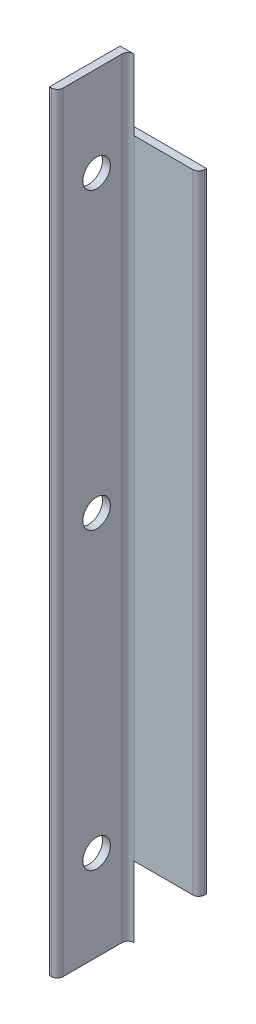
ISO-10303-21;
HEADER;
FILE_DESCRIPTION(('STEP AP214'),'2;1');
FILE_NAME('part.step','',(''),(''),'','','');
FILE_SCHEMA(('AUTOMOTIVE_DESIGN { 1 0 10303 214 1 1 1 1 }'));
ENDSEC;
DATA;
#1=APPLICATION_CONTEXT('core data for automotive mechanical design processes');
#2=APPLICATION_PROTOCOL_DEFINITION('international standard','automotive_design',2000,#1);
#3=PRODUCT_CONTEXT('',#1,'mechanical');
#4=PRODUCT('Part','Part','',(#3));
#5=PRODUCT_RELATED_PRODUCT_CATEGORY('part','',(#4));
#6=PRODUCT_DEFINITION_FORMATION('','',#4);
#7=PRODUCT_DEFINITION_CONTEXT('part definition',#1,'design');
#8=PRODUCT_DEFINITION('design','',#6,#7);
#9=PRODUCT_DEFINITION_SHAPE('','',#8);
#10=(LENGTH_UNIT() NAMED_UNIT(*) SI_UNIT(.MILLI.,.METRE.));
#11=(NAMED_UNIT(*) PLANE_ANGLE_UNIT() SI_UNIT($,.RADIAN.));
#12=(NAMED_UNIT(*) SI_UNIT($,.STERADIAN.) SOLID_ANGLE_UNIT());
#13=UNCERTAINTY_MEASURE_WITH_UNIT(LENGTH_MEASURE(1.E-05),#10,'distance_accuracy_value','');
#14=(GEOMETRIC_REPRESENTATION_CONTEXT(3) GLOBAL_UNCERTAINTY_ASSIGNED_CONTEXT((#13)) GLOBAL_UNIT_ASSIGNED_CONTEXT((#10,
#11,#12)) REPRESENTATION_CONTEXT('',''));
#15=CARTESIAN_POINT('',(0.,0.,0.));
#16=DIRECTION('',(0.,0.,1.));
#17=DIRECTION('',(1.,0.,0.));
#18=AXIS2_PLACEMENT_3D('',#15,#16,#17);
#19=CARTESIAN_POINT('',(-27.4998721449561,392.,-28.2131532770167));
#20=DIRECTION('',(-1.,0.,0.));
#21=DIRECTION('',(0.,0.,1.));
#22=AXIS2_PLACEMENT_3D('',#19,#20,#21);
#23=PLANE('',#22);
#24=DIRECTION('',(0.,-1.,0.));
#25=VECTOR('',#24,1.);
#26=CARTESIAN_POINT('',(-27.4998721449561,392.,-29.2131532770166));
#27=LINE('',#26,#25);
#28=CARTESIAN_POINT('',(-27.4998721449561,356.,-29.2131532770166));
#29=VERTEX_POINT('',#28);
#30=CARTESIAN_POINT('',(-27.4998721449561,36.,-29.2131532770166));
#31=VERTEX_POINT('',#30);
#32=EDGE_CURVE('E157',#29,#31,#27,.T.);
#33=ORIENTED_EDGE('',*,*,#32,.F.);
#34=DIRECTION('',(0.,0.,-1.));
#35=VECTOR('',#34,1.);
#36=CARTESIAN_POINT('',(-27.4998721449561,356.,-29.2131532770166));
#37=LINE('',#36,#35);
#38=CARTESIAN_POINT('',(-27.4998721449561,356.,-28.2131532770167));
#39=VERTEX_POINT('',#38);
#40=EDGE_CURVE('E140',#39,#29,#37,.T.);
#41=ORIENTED_EDGE('',*,*,#40,.F.);
#42=DIRECTION('',(0.,-1.,0.));
#43=VECTOR('',#42,1.);
#44=CARTESIAN_POINT('',(-27.4998721449561,392.,-28.2131532770167));
#45=LINE('',#44,#43);
#46=CARTESIAN_POINT('',(-27.4998721449561,36.,-28.2131532770167));
#47=VERTEX_POINT('',#46);
#48=EDGE_CURVE('E186',#39,#47,#45,.T.);
#49=ORIENTED_EDGE('',*,*,#48,.T.);
#50=DIRECTION('',(0.,0.,1.));
#51=VECTOR('',#50,1.);
#52=CARTESIAN_POINT('',(-27.4998721449561,36.,-29.2131532770166));
#53=LINE('',#52,#51);
#54=EDGE_CURVE('E163',#31,#47,#53,.T.);
#55=ORIENTED_EDGE('',*,*,#54,.F.);
#56=EDGE_LOOP('',(#33,#41,#49,#55));
#57=FACE_BOUND('',#56,.T.);
#58=ADVANCED_FACE('F44',(#57),#23,.F.);
#59=CARTESIAN_POINT('',(-27.4998721449561,392.,-29.2131532770166));
#60=DIRECTION('',(0.,0.,1.));
#61=DIRECTION('',(1.,0.,0.));
#62=AXIS2_PLACEMENT_3D('',#59,#60,#61);
#63=PLANE('',#62);
#64=DIRECTION('',(0.,-1.,0.));
#65=VECTOR('',#64,1.);
#66=CARTESIAN_POINT('',(-67.4998721449565,392.000000000002,-29.2131532770166));
#67=LINE('',#66,#65);
#68=CARTESIAN_POINT('',(-67.4998721449565,356.,-29.2131532770166));
#69=VERTEX_POINT('',#68);
#70=CARTESIAN_POINT('',(-67.499872144956,36.,-29.2131532770166));
#71=VERTEX_POINT('',#70);
#72=EDGE_CURVE('E159',#69,#71,#67,.T.);
#73=ORIENTED_EDGE('',*,*,#72,.F.);
#74=DIRECTION('',(1.,0.,0.));
#75=VECTOR('',#74,1.);
#76=CARTESIAN_POINT('',(-67.4998721449565,356.,-29.2131532770166));
#77=LINE('',#76,#75);
#78=EDGE_CURVE('E144',#69,#29,#77,.T.);
#79=ORIENTED_EDGE('',*,*,#78,.T.);
#80=ORIENTED_EDGE('',*,*,#32,.T.);
#81=DIRECTION('',(1.,0.,0.));
#82=VECTOR('',#81,1.);
#83=CARTESIAN_POINT('',(-67.499872144956,36.,-29.2131532770166));
#84=LINE('',#83,#82);
#85=EDGE_CURVE('E208',#71,#31,#84,.T.);
#86=ORIENTED_EDGE('',*,*,#85,.F.);
#87=EDGE_LOOP('',(#73,#79,#80,#86));
#88=FACE_BOUND('',#87,.T.);
#89=ADVANCED_FACE('F155',(#88),#63,.F.);
#90=CARTESIAN_POINT('',(-67.4998721449565,392.000000000002,-29.2131532770166));
#91=DIRECTION('',(1.,0.,0.));
#92=DIRECTION('',(0.,0.,-1.));
#93=AXIS2_PLACEMENT_3D('',#90,#91,#92);
#94=PLANE('',#93);
#95=CARTESIAN_POINT('',(-67.499872144956,346.,-9.21315327701655));
#96=DIRECTION('',(1.,0.,0.));
#97=DIRECTION('',(0.,0.,-1.));
#98=AXIS2_PLACEMENT_3D('',#95,#96,#97);
#99=CIRCLE('',#98,7.00000000000002);
#100=CARTESIAN_POINT('',(-67.499872144956,346.,-16.2131532770166));
#101=VERTEX_POINT('',#100);
#102=EDGE_CURVE('E221',#101,#101,#99,.T.);
#103=ORIENTED_EDGE('',*,*,#102,.T.);
#104=EDGE_LOOP('',(#103));
#105=FACE_BOUND('',#104,.T.);
#106=CARTESIAN_POINT('',(-67.4998721449565,46.,-9.21315327701655));
#107=DIRECTION('',(1.,0.,0.));
#108=DIRECTION('',(0.,0.,-1.));
#109=AXIS2_PLACEMENT_3D('',#106,#107,#108);
#110=CIRCLE('',#109,7.);
#111=CARTESIAN_POINT('',(-67.4998721449565,46.,-16.2131532770166));
#112=VERTEX_POINT('',#111);
#113=EDGE_CURVE('E232',#112,#112,#110,.T.);
#114=ORIENTED_EDGE('',*,*,#113,.T.);
#115=EDGE_LOOP('',(#114));
#116=FACE_BOUND('',#115,.T.);
#117=CARTESIAN_POINT('',(-67.499872144956,196.,-9.21315327701655));
#118=DIRECTION('',(1.,0.,0.));
#119=DIRECTION('',(0.,0.,-1.));
#120=AXIS2_PLACEMENT_3D('',#117,#118,#119);
#121=CIRCLE('',#120,7.00000000000001);
#122=CARTESIAN_POINT('',(-67.499872144956,196.,-16.2131532770166));
#123=VERTEX_POINT('',#122);
#124=EDGE_CURVE('E235',#123,#123,#121,.T.);
#125=ORIENTED_EDGE('',*,*,#124,.T.);
#126=EDGE_LOOP('',(#125));
#127=FACE_BOUND('',#126,.T.);
#128=DIRECTION('',(0.,-1.,0.));
#129=VECTOR('',#128,1.);
#130=CARTESIAN_POINT('',(-67.4998721449565,392.,-25.2131532770166));
#131=LINE('',#130,#129);
#132=CARTESIAN_POINT('',(-67.4998721449565,392.,-25.2131532770166));
#133=VERTEX_POINT('',#132);
#134=CARTESIAN_POINT('',(-67.4998721449565,356.,-25.2131532770166));
#135=VERTEX_POINT('',#134);
#136=EDGE_CURVE('E58',#133,#135,#131,.T.);
#137=ORIENTED_EDGE('',*,*,#136,.T.);
#138=DIRECTION('',(0.,0.,-1.));
#139=VECTOR('',#138,1.);
#140=CARTESIAN_POINT('',(-67.4998721449565,356.,-29.2131532770166));
#141=LINE('',#140,#139);
#142=EDGE_CURVE('E225',#135,#69,#141,.T.);
#143=ORIENTED_EDGE('',*,*,#142,.T.);
#144=ORIENTED_EDGE('',*,*,#72,.T.);
#145=DIRECTION('',(0.,0.,1.));
#146=VECTOR('',#145,1.);
#147=CARTESIAN_POINT('',(-67.499872144956,36.,-29.2131532770166));
#148=LINE('',#147,#146);
#149=CARTESIAN_POINT('',(-67.499872144956,36.,-25.2131532770166));
#150=VERTEX_POINT('',#149);
#151=EDGE_CURVE('E217',#71,#150,#148,.T.);
#152=ORIENTED_EDGE('',*,*,#151,.T.);
#153=DIRECTION('',(0.,-1.,0.));
#154=VECTOR('',#153,1.);
#155=CARTESIAN_POINT('',(-67.4998721449561,0.,-25.2131532770166));
#156=LINE('',#155,#154);
#157=CARTESIAN_POINT('',(-67.4998721449561,0.,-25.2131532770166));
#158=VERTEX_POINT('',#157);
#159=EDGE_CURVE('E211',#150,#158,#156,.T.);
#160=ORIENTED_EDGE('',*,*,#159,.T.);
#161=DIRECTION('',(0.,0.,1.));
#162=VECTOR('',#161,1.);
#163=CARTESIAN_POINT('',(-67.4998721449561,0.,-29.2131532770166));
#164=LINE('',#163,#162);
#165=CARTESIAN_POINT('',(-67.4998721449561,0.,10.7868467229835));
#166=VERTEX_POINT('',#165);
#167=EDGE_CURVE('E198',#158,#166,#164,.T.);
#168=ORIENTED_EDGE('',*,*,#167,.T.);
#169=DIRECTION('',(0.,-1.,0.));
#170=VECTOR('',#169,1.);
#171=CARTESIAN_POINT('',(-67.4998721449565,392.000000000002,10.7868467229835));
#172=LINE('',#171,#170);
#173=CARTESIAN_POINT('',(-67.4998721449565,392.000000000002,10.7868467229835));
#174=VERTEX_POINT('',#173);
#175=EDGE_CURVE('E166',#174,#166,#172,.T.);
#176=ORIENTED_EDGE('',*,*,#175,.F.);
#177=DIRECTION('',(0.,0.,1.));
#178=VECTOR('',#177,1.);
#179=CARTESIAN_POINT('',(-67.4998721449565,392.000000000002,-29.2131532770166));
#180=LINE('',#179,#178);
#181=EDGE_CURVE('E98',#133,#174,#180,.T.);
#182=ORIENTED_EDGE('',*,*,#181,.F.);
#183=EDGE_LOOP('',(#137,#143,#144,#152,#160,#168,#176,#182));
#184=FACE_BOUND('',#183,.T.);
#185=ADVANCED_FACE('F274',(#105,#116,#127,#184),#94,.F.);
#186=CARTESIAN_POINT('',(-67.4998721449565,392.000000000002,10.7868467229835));
#187=DIRECTION('',(0.,0.,-1.));
#188=DIRECTION('',(-1.,0.,0.));
#189=AXIS2_PLACEMENT_3D('',#186,#187,#188);
#190=PLANE('',#189);
#191=DIRECTION('',(1.,0.,0.));
#192=VECTOR('',#191,1.);
#193=CARTESIAN_POINT('',(-67.4998721449561,0.,10.7868467229835));
#194=LINE('',#193,#192);
#195=CARTESIAN_POINT('',(-66.4998721449561,0.,10.7868467229835));
#196=VERTEX_POINT('',#195);
#197=EDGE_CURVE('E196',#166,#196,#194,.T.);
#198=ORIENTED_EDGE('',*,*,#197,.T.);
#199=DIRECTION('',(0.,-1.,0.));
#200=VECTOR('',#199,1.);
#201=CARTESIAN_POINT('',(-66.4998721449565,392.,10.7868467229835));
#202=LINE('',#201,#200);
#203=CARTESIAN_POINT('',(-66.4998721449565,392.,10.7868467229835));
#204=VERTEX_POINT('',#203);
#205=EDGE_CURVE('E171',#204,#196,#202,.T.);
#206=ORIENTED_EDGE('',*,*,#205,.F.);
#207=DIRECTION('',(1.,0.,0.));
#208=VECTOR('',#207,1.);
#209=CARTESIAN_POINT('',(-67.4998721449565,392.000000000002,10.7868467229835));
#210=LINE('',#209,#208);
#211=EDGE_CURVE('E204',#174,#204,#210,.T.);
#212=ORIENTED_EDGE('',*,*,#211,.F.);
#213=ORIENTED_EDGE('',*,*,#175,.T.);
#214=EDGE_LOOP('',(#198,#206,#212,#213));
#215=FACE_BOUND('',#214,.T.);
#216=ADVANCED_FACE('F303',(#215),#190,.F.);
#217=CARTESIAN_POINT('',(-66.4998721449565,392.,7.78684672298335));
#218=DIRECTION('',(0.,-1.,0.));
#219=DIRECTION('',(0.,0.,-1.));
#220=AXIS2_PLACEMENT_3D('',#217,#218,#219);
#221=CYLINDRICAL_SURFACE('',#220,3.);
#222=CARTESIAN_POINT('',(-66.4998721449561,0.,7.78684672298335));
#223=DIRECTION('',(0.,1.,0.));
#224=DIRECTION('',(0.,0.,1.));
#225=AXIS2_PLACEMENT_3D('',#222,#223,#224);
#226=CIRCLE('',#225,3.);
#227=CARTESIAN_POINT('',(-63.4998721449561,0.,7.78684672298335));
#228=VERTEX_POINT('',#227);
#229=EDGE_CURVE('E194',#196,#228,#226,.T.);
#230=ORIENTED_EDGE('',*,*,#229,.T.);
#231=DIRECTION('',(0.,-1.,0.));
#232=VECTOR('',#231,1.);
#233=CARTESIAN_POINT('',(-63.4998721449565,392.,7.78684672298335));
#234=LINE('',#233,#232);
#235=CARTESIAN_POINT('',(-63.4998721449565,392.,7.78684672298335));
#236=VERTEX_POINT('',#235);
#237=EDGE_CURVE('E174',#236,#228,#234,.T.);
#238=ORIENTED_EDGE('',*,*,#237,.F.);
#239=CARTESIAN_POINT('',(-66.4998721449565,392.,7.78684672298335));
#240=DIRECTION('',(0.,1.,0.));
#241=DIRECTION('',(0.,0.,1.));
#242=AXIS2_PLACEMENT_3D('',#239,#240,#241);
#243=CIRCLE('',#242,3.);
#244=EDGE_CURVE('E202',#204,#236,#243,.T.);
#245=ORIENTED_EDGE('',*,*,#244,.F.);
#246=ORIENTED_EDGE('',*,*,#205,.T.);
#247=EDGE_LOOP('',(#230,#238,#245,#246));
#248=FACE_BOUND('',#247,.T.);
#249=ADVANCED_FACE('F255',(#248),#221,.T.);
#250=CARTESIAN_POINT('',(-63.4998721449565,392.,7.78684672298335));
#251=DIRECTION('',(-1.,0.,0.));
#252=DIRECTION('',(0.,0.,1.));
#253=AXIS2_PLACEMENT_3D('',#250,#251,#252);
#254=PLANE('',#253);
#255=CARTESIAN_POINT('',(-63.499872144956,346.,-9.21315327701655));
#256=DIRECTION('',(1.,0.,0.));
#257=DIRECTION('',(0.,0.,-1.));
#258=AXIS2_PLACEMENT_3D('',#255,#256,#257);
#259=CIRCLE('',#258,7.00000000000002);
#260=CARTESIAN_POINT('',(-63.499872144956,346.,-16.2131532770166));
#261=VERTEX_POINT('',#260);
#262=EDGE_CURVE('E242',#261,#261,#259,.T.);
#263=ORIENTED_EDGE('',*,*,#262,.F.);
#264=EDGE_LOOP('',(#263));
#265=FACE_BOUND('',#264,.T.);
#266=CARTESIAN_POINT('',(-63.4998721449565,46.,-9.21315327701655));
#267=DIRECTION('',(1.,0.,0.));
#268=DIRECTION('',(0.,0.,-1.));
#269=AXIS2_PLACEMENT_3D('',#266,#267,#268);
#270=CIRCLE('',#269,7.);
#271=CARTESIAN_POINT('',(-63.4998721449565,46.,-16.2131532770166));
#272=VERTEX_POINT('',#271);
#273=EDGE_CURVE('E241',#272,#272,#270,.T.);
#274=ORIENTED_EDGE('',*,*,#273,.F.);
#275=EDGE_LOOP('',(#274));
#276=FACE_BOUND('',#275,.T.);
#277=CARTESIAN_POINT('',(-63.499872144956,196.,-9.21315327701655));
#278=DIRECTION('',(1.,0.,0.));
#279=DIRECTION('',(0.,0.,-1.));
#280=AXIS2_PLACEMENT_3D('',#277,#278,#279);
#281=CIRCLE('',#280,7.00000000000001);
#282=CARTESIAN_POINT('',(-63.499872144956,196.,-16.2131532770166));
#283=VERTEX_POINT('',#282);
#284=EDGE_CURVE('E238',#283,#283,#281,.T.);
#285=ORIENTED_EDGE('',*,*,#284,.F.);
#286=EDGE_LOOP('',(#285));
#287=FACE_BOUND('',#286,.T.);
#288=DIRECTION('',(0.,0.,-1.));
#289=VECTOR('',#288,1.);
#290=CARTESIAN_POINT('',(-63.4998721449561,0.,7.78684672298335));
#291=LINE('',#290,#289);
#292=CARTESIAN_POINT('',(-63.4998721449561,9.43689570931383E-13,-22.2131532770167));
#293=VERTEX_POINT('',#292);
#294=EDGE_CURVE('E192',#228,#293,#291,.T.);
#295=ORIENTED_EDGE('',*,*,#294,.T.);
#296=DIRECTION('',(0.,-1.,0.));
#297=VECTOR('',#296,1.);
#298=CARTESIAN_POINT('',(-63.4998721449565,392.,-22.2131532770167));
#299=LINE('',#298,#297);
#300=CARTESIAN_POINT('',(-63.4998721449565,392.,-22.2131532770167));
#301=VERTEX_POINT('',#300);
#302=EDGE_CURVE('E177',#301,#293,#299,.T.);
#303=ORIENTED_EDGE('',*,*,#302,.F.);
#304=DIRECTION('',(0.,0.,-1.));
#305=VECTOR('',#304,1.);
#306=CARTESIAN_POINT('',(-63.4998721449565,392.,7.78684672298335));
#307=LINE('',#306,#305);
#308=EDGE_CURVE('E67',#236,#301,#307,.T.);
#309=ORIENTED_EDGE('',*,*,#308,.F.);
#310=ORIENTED_EDGE('',*,*,#237,.T.);
#311=EDGE_LOOP('',(#295,#303,#309,#310));
#312=FACE_BOUND('',#311,.T.);
#313=ADVANCED_FACE('F251',(#265,#276,#287,#312),#254,.F.);
#314=CARTESIAN_POINT('',(-60.4998721449561,392.,-22.2131532770167));
#315=DIRECTION('',(0.,-1.,0.));
#316=DIRECTION('',(0.,0.,-1.));
#317=AXIS2_PLACEMENT_3D('',#314,#315,#316);
#318=CYLINDRICAL_SURFACE('',#317,3.);
#319=CARTESIAN_POINT('',(-60.4998721449561,1.11022302462516E-13,-22.2131532770167));
#320=DIRECTION('',(0.,-1.,0.));
#321=DIRECTION('',(0.,0.,-1.));
#322=AXIS2_PLACEMENT_3D('',#319,#320,#321);
#323=CIRCLE('',#322,3.);
#324=CARTESIAN_POINT('',(-60.4998721449561,-7.21644966006352E-13,-25.2131532770166));
#325=VERTEX_POINT('',#324);
#326=EDGE_CURVE('E189',#293,#325,#323,.T.);
#327=ORIENTED_EDGE('',*,*,#326,.T.);
#328=DIRECTION('',(0.,-1.,0.));
#329=VECTOR('',#328,1.);
#330=CARTESIAN_POINT('',(-60.4998721449561,392.,-25.2131532770166));
#331=LINE('',#330,#329);
#332=CARTESIAN_POINT('',(-60.4998721449561,35.9999999999993,-25.2131532770166));
#333=VERTEX_POINT('',#332);
#334=EDGE_CURVE('E92',#325,#333,#331,.F.);
#335=ORIENTED_EDGE('',*,*,#334,.T.);
#336=DIRECTION('',(0.,-1.,0.));
#337=VECTOR('',#336,1.);
#338=CARTESIAN_POINT('',(-60.4998721449561,392.,-25.2131532770166));
#339=LINE('',#338,#337);
#340=CARTESIAN_POINT('',(-60.4998721449561,356.,-25.2131532770166));
#341=VERTEX_POINT('',#340);
#342=EDGE_CURVE('E182',#341,#333,#339,.T.);
#343=ORIENTED_EDGE('',*,*,#342,.F.);
#344=CARTESIAN_POINT('',(-60.4998721449561,392.,-25.2131532770166));
#345=VERTEX_POINT('',#344);
#346=EDGE_CURVE('E180',#345,#341,#339,.T.);
#347=ORIENTED_EDGE('',*,*,#346,.F.);
#348=CARTESIAN_POINT('',(-60.4998721449561,392.,-22.2131532770167));
#349=DIRECTION('',(0.,-1.,0.));
#350=DIRECTION('',(0.,0.,-1.));
#351=AXIS2_PLACEMENT_3D('',#348,#349,#350);
#352=CIRCLE('',#351,3.);
#353=EDGE_CURVE('E188',#301,#345,#352,.T.);
#354=ORIENTED_EDGE('',*,*,#353,.F.);
#355=ORIENTED_EDGE('',*,*,#302,.T.);
#356=EDGE_LOOP('',(#327,#335,#343,#347,#354,#355));
#357=FACE_BOUND('',#356,.T.);
#358=ADVANCED_FACE('F254',(#357),#318,.F.);
#359=CARTESIAN_POINT('',(-60.4998721449561,392.,-25.2131532770166));
#360=DIRECTION('',(0.,0.,-1.));
#361=DIRECTION('',(-1.,0.,0.));
#362=AXIS2_PLACEMENT_3D('',#359,#360,#361);
#363=PLANE('',#362);
#364=DIRECTION('',(0.,-1.,0.));
#365=VECTOR('',#364,1.);
#366=CARTESIAN_POINT('',(-30.4998721449561,392.,-25.2131532770166));
#367=LINE('',#366,#365);
#368=CARTESIAN_POINT('',(-30.4998721449561,356.,-25.2131532770166));
#369=VERTEX_POINT('',#368);
#370=CARTESIAN_POINT('',(-30.4998721449561,35.9999999999991,-25.2131532770166));
#371=VERTEX_POINT('',#370);
#372=EDGE_CURVE('E183',#369,#371,#367,.T.);
#373=ORIENTED_EDGE('',*,*,#372,.F.);
#374=DIRECTION('',(1.,0.,0.));
#375=VECTOR('',#374,1.);
#376=CARTESIAN_POINT('',(-67.4998721449565,356.,-25.2131532770166));
#377=LINE('',#376,#375);
#378=EDGE_CURVE('E224',#341,#369,#377,.T.);
#379=ORIENTED_EDGE('',*,*,#378,.F.);
#380=ORIENTED_EDGE('',*,*,#342,.T.);
#381=DIRECTION('',(1.,0.,0.));
#382=VECTOR('',#381,1.);
#383=CARTESIAN_POINT('',(-67.499872144956,36.,-25.2131532770166));
#384=LINE('',#383,#382);
#385=EDGE_CURVE('E210',#333,#371,#384,.T.);
#386=ORIENTED_EDGE('',*,*,#385,.T.);
#387=EDGE_LOOP('',(#373,#379,#380,#386));
#388=FACE_BOUND('',#387,.T.);
#389=ADVANCED_FACE('F283',(#388),#363,.F.);
#390=CARTESIAN_POINT('',(-30.4998721449561,392.,-28.2131532770167));
#391=DIRECTION('',(0.,-1.,0.));
#392=DIRECTION('',(0.,0.,-1.));
#393=AXIS2_PLACEMENT_3D('',#390,#391,#392);
#394=CYLINDRICAL_SURFACE('',#393,3.);
#395=ORIENTED_EDGE('',*,*,#48,.F.);
#396=CARTESIAN_POINT('',(-30.4998721449561,356.,-28.2131532770167));
#397=DIRECTION('',(0.,-1.,0.));
#398=DIRECTION('',(0.,0.,-1.));
#399=AXIS2_PLACEMENT_3D('',#396,#397,#398);
#400=CIRCLE('',#399,3.);
#401=EDGE_CURVE('E13',#39,#369,#400,.T.);
#402=ORIENTED_EDGE('',*,*,#401,.T.);
#403=ORIENTED_EDGE('',*,*,#372,.T.);
#404=CARTESIAN_POINT('',(-30.4998721449561,36.,-28.2131532770167));
#405=DIRECTION('',(0.,1.,0.));
#406=DIRECTION('',(0.,0.,1.));
#407=AXIS2_PLACEMENT_3D('',#404,#405,#406);
#408=CIRCLE('',#407,3.);
#409=EDGE_CURVE('E51',#371,#47,#408,.T.);
#410=ORIENTED_EDGE('',*,*,#409,.T.);
#411=EDGE_LOOP('',(#395,#402,#403,#410));
#412=FACE_BOUND('',#411,.T.);
#413=ADVANCED_FACE('F285',(#412),#394,.T.);
#414=CARTESIAN_POINT('',(-66.4998721449565,392.,7.78684672298335));
#415=DIRECTION('',(0.,1.,0.));
#416=DIRECTION('',(0.,0.,1.));
#417=AXIS2_PLACEMENT_3D('',#414,#415,#416);
#418=PLANE('',#417);
#419=DIRECTION('',(1.,0.,0.));
#420=VECTOR('',#419,1.);
#421=CARTESIAN_POINT('',(-67.4998721449565,392.,-25.2131532770166));
#422=LINE('',#421,#420);
#423=EDGE_CURVE('E222',#133,#345,#422,.T.);
#424=ORIENTED_EDGE('',*,*,#423,.F.);
#425=ORIENTED_EDGE('',*,*,#181,.T.);
#426=ORIENTED_EDGE('',*,*,#211,.T.);
#427=ORIENTED_EDGE('',*,*,#244,.T.);
#428=ORIENTED_EDGE('',*,*,#308,.T.);
#429=ORIENTED_EDGE('',*,*,#353,.T.);
#430=EDGE_LOOP('',(#424,#425,#426,#427,#428,#429));
#431=FACE_BOUND('',#430,.T.);
#432=ADVANCED_FACE('F287',(#431),#418,.T.);
#433=CARTESIAN_POINT('',(-66.4998721449561,0.,7.78684672298335));
#434=DIRECTION('',(0.,1.,0.));
#435=DIRECTION('',(0.,0.,1.));
#436=AXIS2_PLACEMENT_3D('',#433,#434,#435);
#437=PLANE('',#436);
#438=ORIENTED_EDGE('',*,*,#167,.F.);
#439=DIRECTION('',(1.,0.,0.));
#440=VECTOR('',#439,1.);
#441=CARTESIAN_POINT('',(-67.4998721449561,0.,-25.2131532770166));
#442=LINE('',#441,#440);
#443=EDGE_CURVE('E150',#158,#325,#442,.T.);
#444=ORIENTED_EDGE('',*,*,#443,.T.);
#445=ORIENTED_EDGE('',*,*,#326,.F.);
#446=ORIENTED_EDGE('',*,*,#294,.F.);
#447=ORIENTED_EDGE('',*,*,#229,.F.);
#448=ORIENTED_EDGE('',*,*,#197,.F.);
#449=EDGE_LOOP('',(#438,#444,#445,#446,#447,#448));
#450=FACE_BOUND('',#449,.T.);
#451=ADVANCED_FACE('F269',(#450),#437,.F.);
#452=CARTESIAN_POINT('',(-67.499872144956,36.,-29.2131532770166));
#453=DIRECTION('',(0.,1.,0.));
#454=DIRECTION('',(0.,0.,1.));
#455=AXIS2_PLACEMENT_3D('',#452,#453,#454);
#456=PLANE('',#455);
#457=ORIENTED_EDGE('',*,*,#385,.F.);
#458=EDGE_CURVE('E212',#150,#333,#384,.T.);
#459=ORIENTED_EDGE('',*,*,#458,.F.);
#460=ORIENTED_EDGE('',*,*,#151,.F.);
#461=ORIENTED_EDGE('',*,*,#85,.T.);
#462=ORIENTED_EDGE('',*,*,#54,.T.);
#463=ORIENTED_EDGE('',*,*,#409,.F.);
#464=EDGE_LOOP('',(#457,#459,#460,#461,#462,#463));
#465=FACE_BOUND('',#464,.T.);
#466=ADVANCED_FACE('F276',(#465),#456,.F.);
#467=CARTESIAN_POINT('',(-67.4998721449561,0.,-25.2131532770166));
#468=DIRECTION('',(0.,0.,1.));
#469=DIRECTION('',(0.,-1.,0.));
#470=AXIS2_PLACEMENT_3D('',#467,#468,#469);
#471=PLANE('',#470);
#472=ORIENTED_EDGE('',*,*,#443,.F.);
#473=ORIENTED_EDGE('',*,*,#159,.F.);
#474=ORIENTED_EDGE('',*,*,#458,.T.);
#475=ORIENTED_EDGE('',*,*,#334,.F.);
#476=EDGE_LOOP('',(#472,#473,#474,#475));
#477=FACE_BOUND('',#476,.T.);
#478=ADVANCED_FACE('F272',(#477),#471,.F.);
#479=CARTESIAN_POINT('',(-67.4998721449565,356.,-29.2131532770166));
#480=DIRECTION('',(0.,-1.,0.));
#481=DIRECTION('',(0.,0.,-1.));
#482=AXIS2_PLACEMENT_3D('',#479,#480,#481);
#483=PLANE('',#482);
#484=ORIENTED_EDGE('',*,*,#40,.T.);
#485=ORIENTED_EDGE('',*,*,#78,.F.);
#486=ORIENTED_EDGE('',*,*,#142,.F.);
#487=EDGE_CURVE('E160',#135,#341,#377,.T.);
#488=ORIENTED_EDGE('',*,*,#487,.T.);
#489=ORIENTED_EDGE('',*,*,#378,.T.);
#490=ORIENTED_EDGE('',*,*,#401,.F.);
#491=EDGE_LOOP('',(#484,#485,#486,#488,#489,#490));
#492=FACE_BOUND('',#491,.T.);
#493=ADVANCED_FACE('F142',(#492),#483,.F.);
#494=CARTESIAN_POINT('',(-67.4998721449565,392.,-25.2131532770166));
#495=DIRECTION('',(0.,0.,1.));
#496=DIRECTION('',(0.,-1.,0.));
#497=AXIS2_PLACEMENT_3D('',#494,#495,#496);
#498=PLANE('',#497);
#499=ORIENTED_EDGE('',*,*,#487,.F.);
#500=ORIENTED_EDGE('',*,*,#136,.F.);
#501=ORIENTED_EDGE('',*,*,#423,.T.);
#502=ORIENTED_EDGE('',*,*,#346,.T.);
#503=EDGE_LOOP('',(#499,#500,#501,#502));
#504=FACE_BOUND('',#503,.T.);
#505=ADVANCED_FACE('F364',(#504),#498,.F.);
#506=CARTESIAN_POINT('',(-73.499872144956,196.,-9.21315327701655));
#507=DIRECTION('',(1.,0.,0.));
#508=DIRECTION('',(0.,0.,-1.));
#509=AXIS2_PLACEMENT_3D('',#506,#507,#508);
#510=CYLINDRICAL_SURFACE('',#509,7.00000000000001);
#511=ORIENTED_EDGE('',*,*,#284,.T.);
#512=EDGE_LOOP('',(#511));
#513=FACE_BOUND('',#512,.T.);
#514=ORIENTED_EDGE('',*,*,#124,.F.);
#515=EDGE_LOOP('',(#514));
#516=FACE_BOUND('',#515,.T.);
#517=ADVANCED_FACE('F373',(#513,#516),#510,.F.);
#518=CARTESIAN_POINT('',(-73.4998721449565,46.,-9.21315327701655));
#519=DIRECTION('',(1.,0.,0.));
#520=DIRECTION('',(0.,0.,-1.));
#521=AXIS2_PLACEMENT_3D('',#518,#519,#520);
#522=CYLINDRICAL_SURFACE('',#521,7.);
#523=ORIENTED_EDGE('',*,*,#273,.T.);
#524=EDGE_LOOP('',(#523));
#525=FACE_BOUND('',#524,.T.);
#526=ORIENTED_EDGE('',*,*,#113,.F.);
#527=EDGE_LOOP('',(#526));
#528=FACE_BOUND('',#527,.T.);
#529=ADVANCED_FACE('F248',(#525,#528),#522,.F.);
#530=CARTESIAN_POINT('',(-73.499872144956,345.999999999998,-9.21315327701655));
#531=DIRECTION('',(1.,0.,0.));
#532=DIRECTION('',(0.,0.,-1.));
#533=AXIS2_PLACEMENT_3D('',#530,#531,#532);
#534=CYLINDRICAL_SURFACE('',#533,7.00000000000002);
#535=ORIENTED_EDGE('',*,*,#262,.T.);
#536=EDGE_LOOP('',(#535));
#537=FACE_BOUND('',#536,.T.);
#538=ORIENTED_EDGE('',*,*,#102,.F.);
#539=EDGE_LOOP('',(#538));
#540=FACE_BOUND('',#539,.T.);
#541=ADVANCED_FACE('F391',(#537,#540),#534,.F.);
#542=CLOSED_SHELL('',(#58,#89,#185,#216,#249,#313,#358,#389,#413,#432,#451,#466,#478,#493,#505,
#517,#529,#541));
#543=MANIFOLD_SOLID_BREP('B2',#542);
#544=ADVANCED_BREP_SHAPE_REPRESENTATION('',(#18,#543),#14);
#545=SHAPE_DEFINITION_REPRESENTATION(#9,#544);
ENDSEC;
END-ISO-10303-21;
